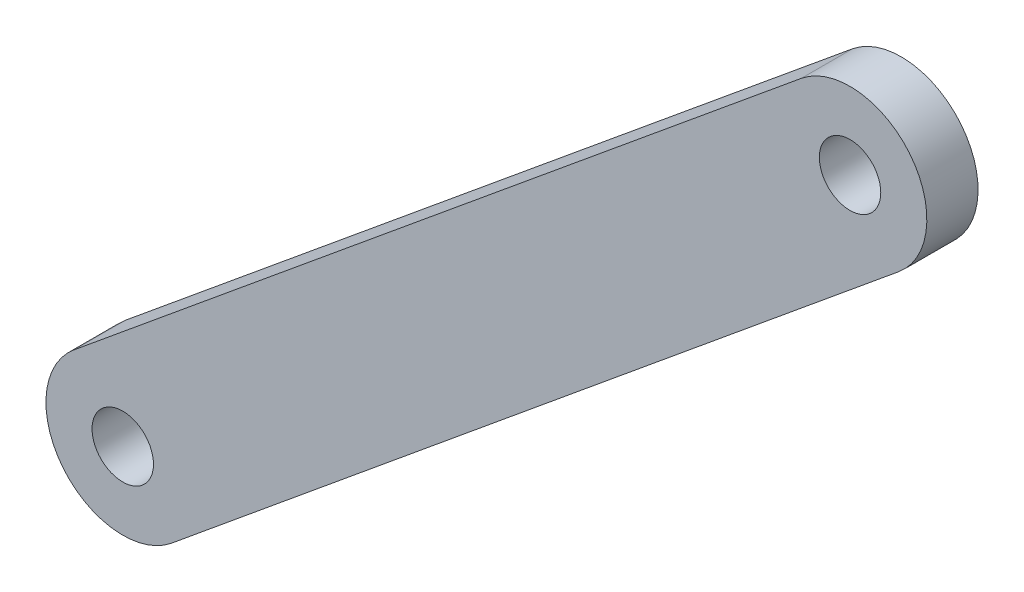
ISO-10303-21;
HEADER;
FILE_DESCRIPTION(('STEP AP214'),'2;1');
FILE_NAME('part.step','',(''),(''),'','','');
FILE_SCHEMA(('AUTOMOTIVE_DESIGN { 1 0 10303 214 1 1 1 1 }'));
ENDSEC;
DATA;
#1=APPLICATION_CONTEXT('core data for automotive mechanical design processes');
#2=APPLICATION_PROTOCOL_DEFINITION('international standard','automotive_design',2000,#1);
#3=PRODUCT_CONTEXT('',#1,'mechanical');
#4=PRODUCT('Part','Part','',(#3));
#5=PRODUCT_RELATED_PRODUCT_CATEGORY('part','',(#4));
#6=PRODUCT_DEFINITION_FORMATION('','',#4);
#7=PRODUCT_DEFINITION_CONTEXT('part definition',#1,'design');
#8=PRODUCT_DEFINITION('design','',#6,#7);
#9=PRODUCT_DEFINITION_SHAPE('','',#8);
#10=(LENGTH_UNIT() NAMED_UNIT(*) SI_UNIT(.MILLI.,.METRE.));
#11=(NAMED_UNIT(*) PLANE_ANGLE_UNIT() SI_UNIT($,.RADIAN.));
#12=(NAMED_UNIT(*) SI_UNIT($,.STERADIAN.) SOLID_ANGLE_UNIT());
#13=UNCERTAINTY_MEASURE_WITH_UNIT(LENGTH_MEASURE(1.E-05),#10,'distance_accuracy_value','');
#14=(GEOMETRIC_REPRESENTATION_CONTEXT(3) GLOBAL_UNCERTAINTY_ASSIGNED_CONTEXT((#13)) GLOBAL_UNIT_ASSIGNED_CONTEXT((#10,
#11,#12)) REPRESENTATION_CONTEXT('',''));
#15=CARTESIAN_POINT('',(0.,0.,0.));
#16=DIRECTION('',(0.,0.,1.));
#17=DIRECTION('',(1.,0.,0.));
#18=AXIS2_PLACEMENT_3D('',#15,#16,#17);
#19=CARTESIAN_POINT('',(20.,0.,-5.));
#20=DIRECTION('',(0.,0.,-1.));
#21=DIRECTION('',(-1.,0.,0.));
#22=AXIS2_PLACEMENT_3D('',#19,#20,#21);
#23=CYLINDRICAL_SURFACE('',#22,7.50000000000002);
#24=CARTESIAN_POINT('',(20.,0.,-10.));
#25=DIRECTION('',(0.,0.,1.));
#26=DIRECTION('',(1.,0.,0.));
#27=AXIS2_PLACEMENT_3D('',#24,#25,#26);
#28=CIRCLE('',#27,7.50000000000002);
#29=CARTESIAN_POINT('',(24.767075252096,-5.79007716190848,-10.));
#30=VERTEX_POINT('',#29);
#31=CARTESIAN_POINT('',(15.232924747904,5.79007716190849,-10.));
#32=VERTEX_POINT('',#31);
#33=EDGE_CURVE('E100',#30,#32,#28,.T.);
#34=ORIENTED_EDGE('',*,*,#33,.T.);
#35=DIRECTION('',(0.,0.,-1.));
#36=VECTOR('',#35,1.);
#37=CARTESIAN_POINT('',(15.232924747904,5.79007716190849,-5.));
#38=LINE('',#37,#36);
#39=CARTESIAN_POINT('',(15.232924747904,5.79007716190849,-5.));
#40=VERTEX_POINT('',#39);
#41=EDGE_CURVE('E11',#40,#32,#38,.T.);
#42=ORIENTED_EDGE('',*,*,#41,.F.);
#43=CARTESIAN_POINT('',(20.,0.,-5.));
#44=DIRECTION('',(0.,0.,1.));
#45=DIRECTION('',(1.,0.,0.));
#46=AXIS2_PLACEMENT_3D('',#43,#44,#45);
#47=CIRCLE('',#46,7.50000000000002);
#48=CARTESIAN_POINT('',(24.767075252096,-5.79007716190848,-5.));
#49=VERTEX_POINT('',#48);
#50=EDGE_CURVE('E88',#49,#40,#47,.T.);
#51=ORIENTED_EDGE('',*,*,#50,.F.);
#52=DIRECTION('',(0.,0.,-1.));
#53=VECTOR('',#52,1.);
#54=CARTESIAN_POINT('',(24.767075252096,-5.79007716190848,-5.));
#55=LINE('',#54,#53);
#56=EDGE_CURVE('E96',#49,#30,#55,.T.);
#57=ORIENTED_EDGE('',*,*,#56,.T.);
#58=EDGE_LOOP('',(#34,#42,#51,#57));
#59=FACE_BOUND('',#58,.T.);
#60=ADVANCED_FACE('F37',(#59),#23,.T.);
#61=CARTESIAN_POINT('',(15.232924747904,5.79007716190849,-5.));
#62=DIRECTION('',(0.635610033612797,-0.772010288254463,0.));
#63=DIRECTION('',(0.772010288254463,0.635610033612797,0.));
#64=AXIS2_PLACEMENT_3D('',#61,#62,#63);
#65=PLANE('',#64);
#66=DIRECTION('',(-0.772010288254463,-0.635610033612797,0.));
#67=VECTOR('',#66,1.);
#68=CARTESIAN_POINT('',(15.232924747904,5.79007716190849,-10.));
#69=LINE('',#68,#67);
#70=CARTESIAN_POINT('',(-55.7920217715066,-52.6860459304688,-10.));
#71=VERTEX_POINT('',#70);
#72=EDGE_CURVE('E92',#32,#71,#69,.T.);
#73=ORIENTED_EDGE('',*,*,#72,.T.);
#74=DIRECTION('',(0.,0.,-1.));
#75=VECTOR('',#74,1.);
#76=CARTESIAN_POINT('',(-55.7920217715066,-52.6860459304688,-5.));
#77=LINE('',#76,#75);
#78=CARTESIAN_POINT('',(-55.7920217715066,-52.6860459304688,-5.));
#79=VERTEX_POINT('',#78);
#80=EDGE_CURVE('E45',#79,#71,#77,.T.);
#81=ORIENTED_EDGE('',*,*,#80,.F.);
#82=DIRECTION('',(-0.772010288254463,-0.635610033612797,0.));
#83=VECTOR('',#82,1.);
#84=CARTESIAN_POINT('',(15.232924747904,5.79007716190849,-5.));
#85=LINE('',#84,#83);
#86=EDGE_CURVE('E83',#40,#79,#85,.T.);
#87=ORIENTED_EDGE('',*,*,#86,.F.);
#88=ORIENTED_EDGE('',*,*,#41,.T.);
#89=EDGE_LOOP('',(#73,#81,#87,#88));
#90=FACE_BOUND('',#89,.T.);
#91=ADVANCED_FACE('F91',(#90),#65,.F.);
#92=CARTESIAN_POINT('',(-51.0249465194106,-58.4761230923773,-5.));
#93=DIRECTION('',(0.,0.,-1.));
#94=DIRECTION('',(-1.,0.,0.));
#95=AXIS2_PLACEMENT_3D('',#92,#93,#94);
#96=CYLINDRICAL_SURFACE('',#95,7.49999999999999);
#97=CARTESIAN_POINT('',(-51.0249465194106,-58.4761230923773,-10.));
#98=DIRECTION('',(0.,0.,1.));
#99=DIRECTION('',(1.,0.,0.));
#100=AXIS2_PLACEMENT_3D('',#97,#98,#99);
#101=CIRCLE('',#100,7.49999999999999);
#102=CARTESIAN_POINT('',(-46.2578712673146,-64.2662002542858,-10.));
#103=VERTEX_POINT('',#102);
#104=EDGE_CURVE('E70',#71,#103,#101,.T.);
#105=ORIENTED_EDGE('',*,*,#104,.T.);
#106=DIRECTION('',(0.,0.,-1.));
#107=VECTOR('',#106,1.);
#108=CARTESIAN_POINT('',(-46.2578712673146,-64.2662002542858,-5.));
#109=LINE('',#108,#107);
#110=CARTESIAN_POINT('',(-46.2578712673146,-64.2662002542858,-5.));
#111=VERTEX_POINT('',#110);
#112=EDGE_CURVE('E93',#111,#103,#109,.T.);
#113=ORIENTED_EDGE('',*,*,#112,.F.);
#114=CARTESIAN_POINT('',(-51.0249465194106,-58.4761230923773,-5.));
#115=DIRECTION('',(0.,0.,1.));
#116=DIRECTION('',(1.,0.,0.));
#117=AXIS2_PLACEMENT_3D('',#114,#115,#116);
#118=CIRCLE('',#117,7.49999999999999);
#119=EDGE_CURVE('E86',#79,#111,#118,.T.);
#120=ORIENTED_EDGE('',*,*,#119,.F.);
#121=ORIENTED_EDGE('',*,*,#80,.T.);
#122=EDGE_LOOP('',(#105,#113,#120,#121));
#123=FACE_BOUND('',#122,.T.);
#124=ADVANCED_FACE('F94',(#123),#96,.T.);
#125=CARTESIAN_POINT('',(24.767075252096,-5.79007716190848,-5.));
#126=DIRECTION('',(-0.635610033612797,0.772010288254463,0.));
#127=DIRECTION('',(-0.772010288254463,-0.635610033612797,0.));
#128=AXIS2_PLACEMENT_3D('',#125,#126,#127);
#129=PLANE('',#128);
#130=DIRECTION('',(0.772010288254463,0.635610033612797,0.));
#131=VECTOR('',#130,1.);
#132=CARTESIAN_POINT('',(24.767075252096,-5.79007716190848,-10.));
#133=LINE('',#132,#131);
#134=EDGE_CURVE('E76',#103,#30,#133,.T.);
#135=ORIENTED_EDGE('',*,*,#134,.T.);
#136=ORIENTED_EDGE('',*,*,#56,.F.);
#137=DIRECTION('',(0.772010288254463,0.635610033612797,0.));
#138=VECTOR('',#137,1.);
#139=CARTESIAN_POINT('',(24.767075252096,-5.79007716190848,-5.));
#140=LINE('',#139,#138);
#141=EDGE_CURVE('E53',#111,#49,#140,.T.);
#142=ORIENTED_EDGE('',*,*,#141,.F.);
#143=ORIENTED_EDGE('',*,*,#112,.T.);
#144=EDGE_LOOP('',(#135,#136,#142,#143));
#145=FACE_BOUND('',#144,.T.);
#146=ADVANCED_FACE('F108',(#145),#129,.F.);
#147=CARTESIAN_POINT('',(20.,0.,-5.));
#148=DIRECTION('',(0.,0.,1.));
#149=DIRECTION('',(1.,0.,0.));
#150=AXIS2_PLACEMENT_3D('',#147,#148,#149);
#151=PLANE('',#150);
#152=CARTESIAN_POINT('',(-51.0249465194106,-58.4761230923773,-5.));
#153=DIRECTION('',(0.,0.,1.));
#154=DIRECTION('',(1.,0.,0.));
#155=AXIS2_PLACEMENT_3D('',#152,#153,#154);
#156=CIRCLE('',#155,3.00000000000001);
#157=CARTESIAN_POINT('',(-48.0249465194106,-58.4761230923773,-5.));
#158=VERTEX_POINT('',#157);
#159=EDGE_CURVE('E120',#158,#158,#156,.T.);
#160=ORIENTED_EDGE('',*,*,#159,.F.);
#161=EDGE_LOOP('',(#160));
#162=FACE_BOUND('',#161,.T.);
#163=CARTESIAN_POINT('',(20.,0.,-5.));
#164=DIRECTION('',(0.,0.,1.));
#165=DIRECTION('',(1.,0.,0.));
#166=AXIS2_PLACEMENT_3D('',#163,#164,#165);
#167=CIRCLE('',#166,3.);
#168=CARTESIAN_POINT('',(23.,0.,-5.));
#169=VERTEX_POINT('',#168);
#170=EDGE_CURVE('E117',#169,#169,#167,.T.);
#171=ORIENTED_EDGE('',*,*,#170,.F.);
#172=EDGE_LOOP('',(#171));
#173=FACE_BOUND('',#172,.T.);
#174=ORIENTED_EDGE('',*,*,#50,.T.);
#175=ORIENTED_EDGE('',*,*,#86,.T.);
#176=ORIENTED_EDGE('',*,*,#119,.T.);
#177=ORIENTED_EDGE('',*,*,#141,.T.);
#178=EDGE_LOOP('',(#174,#175,#176,#177));
#179=FACE_BOUND('',#178,.T.);
#180=ADVANCED_FACE('F84',(#162,#173,#179),#151,.T.);
#181=CARTESIAN_POINT('',(20.,0.,-10.));
#182=DIRECTION('',(0.,0.,1.));
#183=DIRECTION('',(1.,0.,0.));
#184=AXIS2_PLACEMENT_3D('',#181,#182,#183);
#185=PLANE('',#184);
#186=CARTESIAN_POINT('',(-51.0249465194106,-58.4761230923773,-10.));
#187=DIRECTION('',(0.,0.,1.));
#188=DIRECTION('',(1.,0.,0.));
#189=AXIS2_PLACEMENT_3D('',#186,#187,#188);
#190=CIRCLE('',#189,3.00000000000001);
#191=CARTESIAN_POINT('',(-48.0249465194106,-58.4761230923773,-10.));
#192=VERTEX_POINT('',#191);
#193=EDGE_CURVE('E103',#192,#192,#190,.T.);
#194=ORIENTED_EDGE('',*,*,#193,.T.);
#195=EDGE_LOOP('',(#194));
#196=FACE_BOUND('',#195,.T.);
#197=CARTESIAN_POINT('',(20.,0.,-10.));
#198=DIRECTION('',(0.,0.,1.));
#199=DIRECTION('',(1.,0.,0.));
#200=AXIS2_PLACEMENT_3D('',#197,#198,#199);
#201=CIRCLE('',#200,3.);
#202=CARTESIAN_POINT('',(23.,0.,-10.));
#203=VERTEX_POINT('',#202);
#204=EDGE_CURVE('E114',#203,#203,#201,.T.);
#205=ORIENTED_EDGE('',*,*,#204,.T.);
#206=EDGE_LOOP('',(#205));
#207=FACE_BOUND('',#206,.T.);
#208=ORIENTED_EDGE('',*,*,#33,.F.);
#209=ORIENTED_EDGE('',*,*,#134,.F.);
#210=ORIENTED_EDGE('',*,*,#104,.F.);
#211=ORIENTED_EDGE('',*,*,#72,.F.);
#212=EDGE_LOOP('',(#208,#209,#210,#211));
#213=FACE_BOUND('',#212,.T.);
#214=ADVANCED_FACE('F111',(#196,#207,#213),#185,.F.);
#215=CARTESIAN_POINT('',(20.,0.,-10.));
#216=DIRECTION('',(0.,0.,1.));
#217=DIRECTION('',(1.,0.,0.));
#218=AXIS2_PLACEMENT_3D('',#215,#216,#217);
#219=CYLINDRICAL_SURFACE('',#218,3.);
#220=ORIENTED_EDGE('',*,*,#204,.F.);
#221=EDGE_LOOP('',(#220));
#222=FACE_BOUND('',#221,.T.);
#223=ORIENTED_EDGE('',*,*,#170,.T.);
#224=EDGE_LOOP('',(#223));
#225=FACE_BOUND('',#224,.T.);
#226=ADVANCED_FACE('F131',(#222,#225),#219,.F.);
#227=CARTESIAN_POINT('',(-51.0249465194106,-58.4761230923773,-10.));
#228=DIRECTION('',(0.,0.,1.));
#229=DIRECTION('',(1.,0.,0.));
#230=AXIS2_PLACEMENT_3D('',#227,#228,#229);
#231=CYLINDRICAL_SURFACE('',#230,3.00000000000001);
#232=ORIENTED_EDGE('',*,*,#193,.F.);
#233=EDGE_LOOP('',(#232));
#234=FACE_BOUND('',#233,.T.);
#235=ORIENTED_EDGE('',*,*,#159,.T.);
#236=EDGE_LOOP('',(#235));
#237=FACE_BOUND('',#236,.T.);
#238=ADVANCED_FACE('F128',(#234,#237),#231,.F.);
#239=CLOSED_SHELL('',(#60,#91,#124,#146,#180,#214,#226,#238));
#240=MANIFOLD_SOLID_BREP('B2',#239);
#241=ADVANCED_BREP_SHAPE_REPRESENTATION('',(#18,#240),#14);
#242=SHAPE_DEFINITION_REPRESENTATION(#9,#241);
ENDSEC;
END-ISO-10303-21;
